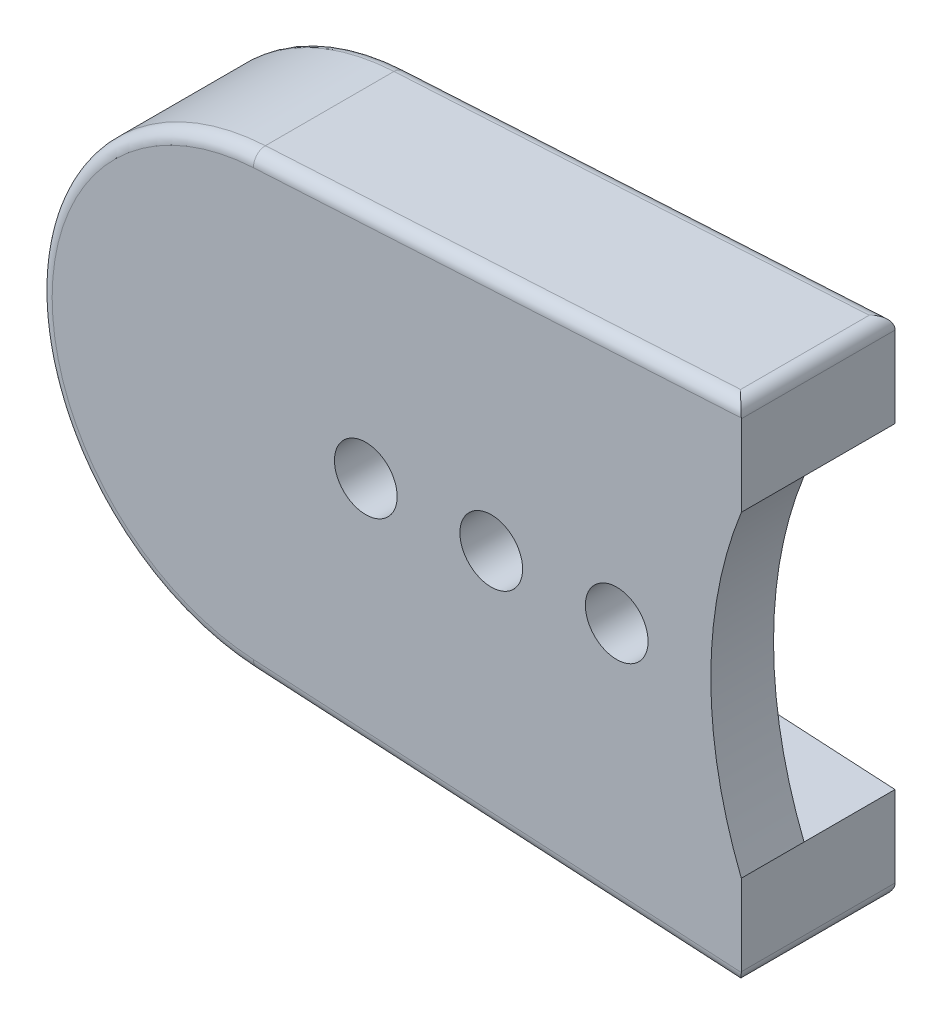
ISO-10303-21;
HEADER;
FILE_DESCRIPTION(('STEP AP214'),'2;1');
FILE_NAME('part.step','',(''),(''),'','','');
FILE_SCHEMA(('AUTOMOTIVE_DESIGN { 1 0 10303 214 1 1 1 1 }'));
ENDSEC;
DATA;
#1=APPLICATION_CONTEXT('core data for automotive mechanical design processes');
#2=APPLICATION_PROTOCOL_DEFINITION('international standard','automotive_design',2000,#1);
#3=PRODUCT_CONTEXT('',#1,'mechanical');
#4=PRODUCT('Part','Part','',(#3));
#5=PRODUCT_RELATED_PRODUCT_CATEGORY('part','',(#4));
#6=PRODUCT_DEFINITION_FORMATION('','',#4);
#7=PRODUCT_DEFINITION_CONTEXT('part definition',#1,'design');
#8=PRODUCT_DEFINITION('design','',#6,#7);
#9=PRODUCT_DEFINITION_SHAPE('','',#8);
#10=(LENGTH_UNIT() NAMED_UNIT(*) SI_UNIT(.MILLI.,.METRE.));
#11=(NAMED_UNIT(*) PLANE_ANGLE_UNIT() SI_UNIT($,.RADIAN.));
#12=(NAMED_UNIT(*) SI_UNIT($,.STERADIAN.) SOLID_ANGLE_UNIT());
#13=UNCERTAINTY_MEASURE_WITH_UNIT(LENGTH_MEASURE(1.E-05),#10,'distance_accuracy_value','');
#14=(GEOMETRIC_REPRESENTATION_CONTEXT(3) GLOBAL_UNCERTAINTY_ASSIGNED_CONTEXT((#13)) GLOBAL_UNIT_ASSIGNED_CONTEXT((#10,
#11,#12)) REPRESENTATION_CONTEXT('',''));
#15=CARTESIAN_POINT('',(0.,0.,0.));
#16=DIRECTION('',(0.,0.,1.));
#17=DIRECTION('',(1.,0.,0.));
#18=AXIS2_PLACEMENT_3D('',#15,#16,#17);
#19=CARTESIAN_POINT('',(0.,0.,1.));
#20=DIRECTION('',(0.,0.,1.));
#21=DIRECTION('',(1.,0.,0.));
#22=AXIS2_PLACEMENT_3D('',#19,#20,#21);
#23=PLANE('',#22);
#24=CARTESIAN_POINT('',(-10.3,0.,1.));
#25=DIRECTION('',(0.,0.,1.));
#26=DIRECTION('',(1.,0.,0.));
#27=AXIS2_PLACEMENT_3D('',#24,#25,#26);
#28=CIRCLE('',#27,0.500000000000001);
#29=CARTESIAN_POINT('',(-9.8,0.,1.));
#30=VERTEX_POINT('',#29);
#31=EDGE_CURVE('E322',#30,#30,#28,.T.);
#32=ORIENTED_EDGE('',*,*,#31,.F.);
#33=EDGE_LOOP('',(#32));
#34=FACE_BOUND('',#33,.T.);
#35=DIRECTION('',(0.998452256545436,-0.0556155679583174,0.));
#36=VECTOR('',#35,1.);
#37=CARTESIAN_POINT('',(-0.232086901508914,-4.16659757390032,1.));
#38=LINE('',#37,#36);
#39=CARTESIAN_POINT('',(-14.0890929310583,-3.39473767225448,1.));
#40=VERTEX_POINT('',#39);
#41=CARTESIAN_POINT('',(-6.31379868961076,-3.82783540171158,1.));
#42=VERTEX_POINT('',#41);
#43=EDGE_CURVE('E194',#40,#42,#38,.T.);
#44=ORIENTED_EDGE('',*,*,#43,.T.);
#45=CARTESIAN_POINT('',(-6.51348914091985,-3.81671228811991,1.));
#46=DIRECTION('',(0.,0.,1.));
#47=DIRECTION('',(1.,0.,0.));
#48=AXIS2_PLACEMENT_3D('',#45,#46,#47);
#49=CIRCLE('',#48,0.2);
#50=CARTESIAN_POINT('',(-6.31348914091985,-3.81671228811991,1.));
#51=VERTEX_POINT('',#50);
#52=EDGE_CURVE('E197',#42,#51,#49,.T.);
#53=ORIENTED_EDGE('',*,*,#52,.T.);
#54=DIRECTION('',(0.,-1.,0.));
#55=VECTOR('',#54,1.);
#56=CARTESIAN_POINT('',(-6.31348914091985,0.,1.));
#57=LINE('',#56,#55);
#58=CARTESIAN_POINT('',(-6.31348914091985,-2.52583745864359,1.));
#59=VERTEX_POINT('',#58);
#60=EDGE_CURVE('E168',#59,#51,#57,.T.);
#61=ORIENTED_EDGE('',*,*,#60,.F.);
#62=CARTESIAN_POINT('',(0.,0.,1.));
#63=DIRECTION('',(0.,0.,-1.));
#64=DIRECTION('',(1.,0.,0.));
#65=AXIS2_PLACEMENT_3D('',#62,#63,#64);
#66=CIRCLE('',#65,6.8);
#67=CARTESIAN_POINT('',(-6.31348914091985,2.52583745864359,1.));
#68=VERTEX_POINT('',#67);
#69=EDGE_CURVE('E164',#59,#68,#66,.T.);
#70=ORIENTED_EDGE('',*,*,#69,.T.);
#71=DIRECTION('',(0.,1.,0.));
#72=VECTOR('',#71,1.);
#73=CARTESIAN_POINT('',(-6.31348914091985,0.,1.));
#74=LINE('',#73,#72);
#75=CARTESIAN_POINT('',(-6.31348914091985,3.81671228811991,1.));
#76=VERTEX_POINT('',#75);
#77=EDGE_CURVE('E147',#68,#76,#74,.T.);
#78=ORIENTED_EDGE('',*,*,#77,.T.);
#79=CARTESIAN_POINT('',(-6.51348914091985,3.81671228811991,1.));
#80=DIRECTION('',(0.,0.,1.));
#81=DIRECTION('',(1.,0.,0.));
#82=AXIS2_PLACEMENT_3D('',#79,#80,#81);
#83=CIRCLE('',#82,0.2);
#84=CARTESIAN_POINT('',(-6.31379868961076,3.82783540171157,1.));
#85=VERTEX_POINT('',#84);
#86=EDGE_CURVE('E180',#76,#85,#83,.T.);
#87=ORIENTED_EDGE('',*,*,#86,.T.);
#88=DIRECTION('',(-0.998452256545436,-0.0556155679583176,0.));
#89=VECTOR('',#88,1.);
#90=CARTESIAN_POINT('',(-0.232086901508914,4.16659757390031,1.));
#91=LINE('',#90,#89);
#92=CARTESIAN_POINT('',(-14.0890929310583,3.39473767225448,1.));
#93=VERTEX_POINT('',#92);
#94=EDGE_CURVE('E184',#85,#93,#91,.T.);
#95=ORIENTED_EDGE('',*,*,#94,.T.);
#96=CARTESIAN_POINT('',(-13.9,0.,1.));
#97=DIRECTION('',(0.,0.,1.));
#98=DIRECTION('',(1.,0.,0.));
#99=AXIS2_PLACEMENT_3D('',#96,#97,#98);
#100=CIRCLE('',#99,3.4);
#101=EDGE_CURVE('E191',#93,#40,#100,.T.);
#102=ORIENTED_EDGE('',*,*,#101,.T.);
#103=EDGE_LOOP('',(#44,#53,#61,#70,#78,#87,#95,#102));
#104=FACE_BOUND('',#103,.T.);
#105=CARTESIAN_POINT('',(-8.3,0.,1.));
#106=DIRECTION('',(0.,0.,1.));
#107=DIRECTION('',(1.,0.,0.));
#108=AXIS2_PLACEMENT_3D('',#105,#106,#107);
#109=CIRCLE('',#108,0.500000000000001);
#110=CARTESIAN_POINT('',(-7.8,0.,1.));
#111=VERTEX_POINT('',#110);
#112=EDGE_CURVE('E330',#111,#111,#109,.T.);
#113=ORIENTED_EDGE('',*,*,#112,.F.);
#114=EDGE_LOOP('',(#113));
#115=FACE_BOUND('',#114,.T.);
#116=CARTESIAN_POINT('',(-12.3,0.,1.));
#117=DIRECTION('',(0.,0.,1.));
#118=DIRECTION('',(1.,0.,0.));
#119=AXIS2_PLACEMENT_3D('',#116,#117,#118);
#120=CIRCLE('',#119,0.500000000000001);
#121=CARTESIAN_POINT('',(-11.8,0.,1.));
#122=VERTEX_POINT('',#121);
#123=EDGE_CURVE('E314',#122,#122,#120,.T.);
#124=ORIENTED_EDGE('',*,*,#123,.F.);
#125=EDGE_LOOP('',(#124));
#126=FACE_BOUND('',#125,.T.);
#127=ADVANCED_FACE('F41',(#34,#104,#115,#126),#23,.T.);
#128=CARTESIAN_POINT('',(0.,0.,0.));
#129=DIRECTION('',(0.,0.,1.));
#130=DIRECTION('',(1.,0.,0.));
#131=AXIS2_PLACEMENT_3D('',#128,#129,#130);
#132=PLANE('',#131);
#133=CARTESIAN_POINT('',(0.,0.,0.));
#134=DIRECTION('',(0.,0.,-1.));
#135=DIRECTION('',(1.,0.,0.));
#136=AXIS2_PLACEMENT_3D('',#133,#134,#135);
#137=CIRCLE('',#136,6.8);
#138=CARTESIAN_POINT('',(-6.31348914091985,-2.52583745864359,0.));
#139=VERTEX_POINT('',#138);
#140=CARTESIAN_POINT('',(-6.31348914091985,2.52583745864359,0.));
#141=VERTEX_POINT('',#140);
#142=EDGE_CURVE('E178',#139,#141,#137,.T.);
#143=ORIENTED_EDGE('',*,*,#142,.F.);
#144=DIRECTION('',(0.998452256545436,-0.0556155679583174,0.));
#145=VECTOR('',#144,1.);
#146=CARTESIAN_POINT('',(-14.0167926927125,-2.09674973874542,0.));
#147=LINE('',#146,#145);
#148=CARTESIAN_POINT('',(-14.0167926927125,-2.09674973874542,0.));
#149=VERTEX_POINT('',#148);
#150=EDGE_CURVE('E173',#149,#139,#147,.T.);
#151=ORIENTED_EDGE('',*,*,#150,.F.);
#152=CARTESIAN_POINT('',(-13.9,0.,0.));
#153=DIRECTION('',(0.,0.,1.));
#154=DIRECTION('',(1.,0.,0.));
#155=AXIS2_PLACEMENT_3D('',#152,#153,#154);
#156=CIRCLE('',#155,2.1);
#157=CARTESIAN_POINT('',(-14.0167926927125,2.09674973874541,0.));
#158=VERTEX_POINT('',#157);
#159=EDGE_CURVE('E342',#158,#149,#156,.T.);
#160=ORIENTED_EDGE('',*,*,#159,.F.);
#161=DIRECTION('',(-0.998452256545436,-0.0556155679583176,0.));
#162=VECTOR('',#161,1.);
#163=CARTESIAN_POINT('',(-6.31348914091985,2.52583745864359,0.));
#164=LINE('',#163,#162);
#165=EDGE_CURVE('E339',#141,#158,#164,.T.);
#166=ORIENTED_EDGE('',*,*,#165,.F.);
#167=EDGE_LOOP('',(#143,#151,#160,#166));
#168=FACE_BOUND('',#167,.T.);
#169=CARTESIAN_POINT('',(-8.3,0.,0.));
#170=DIRECTION('',(0.,0.,1.));
#171=DIRECTION('',(1.,0.,0.));
#172=AXIS2_PLACEMENT_3D('',#169,#170,#171);
#173=CIRCLE('',#172,0.500000000000001);
#174=CARTESIAN_POINT('',(-7.8,0.,0.));
#175=VERTEX_POINT('',#174);
#176=EDGE_CURVE('E326',#175,#175,#173,.T.);
#177=ORIENTED_EDGE('',*,*,#176,.T.);
#178=EDGE_LOOP('',(#177));
#179=FACE_BOUND('',#178,.T.);
#180=CARTESIAN_POINT('',(-10.3,0.,0.));
#181=DIRECTION('',(0.,0.,1.));
#182=DIRECTION('',(1.,0.,0.));
#183=AXIS2_PLACEMENT_3D('',#180,#181,#182);
#184=CIRCLE('',#183,0.500000000000001);
#185=CARTESIAN_POINT('',(-9.8,0.,0.));
#186=VERTEX_POINT('',#185);
#187=EDGE_CURVE('E318',#186,#186,#184,.T.);
#188=ORIENTED_EDGE('',*,*,#187,.T.);
#189=EDGE_LOOP('',(#188));
#190=FACE_BOUND('',#189,.T.);
#191=CARTESIAN_POINT('',(-12.3,0.,0.));
#192=DIRECTION('',(0.,0.,1.));
#193=DIRECTION('',(1.,0.,0.));
#194=AXIS2_PLACEMENT_3D('',#191,#192,#193);
#195=CIRCLE('',#194,0.500000000000001);
#196=CARTESIAN_POINT('',(-11.8,0.,0.));
#197=VERTEX_POINT('',#196);
#198=EDGE_CURVE('E313',#197,#197,#195,.T.);
#199=ORIENTED_EDGE('',*,*,#198,.T.);
#200=EDGE_LOOP('',(#199));
#201=FACE_BOUND('',#200,.T.);
#202=ADVANCED_FACE('F357',(#168,#179,#190,#201),#132,.F.);
#203=CARTESIAN_POINT('',(0.,0.,1.));
#204=DIRECTION('',(0.,0.,-1.));
#205=DIRECTION('',(-1.,0.,0.));
#206=AXIS2_PLACEMENT_3D('',#203,#204,#205);
#207=CYLINDRICAL_SURFACE('',#206,6.8);
#208=ORIENTED_EDGE('',*,*,#142,.T.);
#209=DIRECTION('',(0.,0.,-1.));
#210=VECTOR('',#209,1.);
#211=CARTESIAN_POINT('',(-6.31348914091985,2.52583745864359,1.));
#212=LINE('',#211,#210);
#213=EDGE_CURVE('E153',#68,#141,#212,.T.);
#214=ORIENTED_EDGE('',*,*,#213,.F.);
#215=ORIENTED_EDGE('',*,*,#69,.F.);
#216=DIRECTION('',(0.,0.,-1.));
#217=VECTOR('',#216,1.);
#218=CARTESIAN_POINT('',(-6.31348914091985,-2.52583745864359,1.));
#219=LINE('',#218,#217);
#220=EDGE_CURVE('E172',#59,#139,#219,.T.);
#221=ORIENTED_EDGE('',*,*,#220,.T.);
#222=EDGE_LOOP('',(#208,#214,#215,#221));
#223=FACE_BOUND('',#222,.T.);
#224=ADVANCED_FACE('F176',(#223),#207,.F.);
#225=CARTESIAN_POINT('',(-8.3,0.,1.));
#226=DIRECTION('',(0.,0.,-1.));
#227=DIRECTION('',(-1.,0.,0.));
#228=AXIS2_PLACEMENT_3D('',#225,#226,#227);
#229=CYLINDRICAL_SURFACE('',#228,0.500000000000001);
#230=ORIENTED_EDGE('',*,*,#112,.T.);
#231=EDGE_LOOP('',(#230));
#232=FACE_BOUND('',#231,.T.);
#233=ORIENTED_EDGE('',*,*,#176,.F.);
#234=EDGE_LOOP('',(#233));
#235=FACE_BOUND('',#234,.T.);
#236=ADVANCED_FACE('F423',(#232,#235),#229,.F.);
#237=CARTESIAN_POINT('',(-10.3,0.,1.));
#238=DIRECTION('',(0.,0.,-1.));
#239=DIRECTION('',(-1.,0.,0.));
#240=AXIS2_PLACEMENT_3D('',#237,#238,#239);
#241=CYLINDRICAL_SURFACE('',#240,0.500000000000001);
#242=ORIENTED_EDGE('',*,*,#31,.T.);
#243=EDGE_LOOP('',(#242));
#244=FACE_BOUND('',#243,.T.);
#245=ORIENTED_EDGE('',*,*,#187,.F.);
#246=EDGE_LOOP('',(#245));
#247=FACE_BOUND('',#246,.T.);
#248=ADVANCED_FACE('F459',(#244,#247),#241,.F.);
#249=CARTESIAN_POINT('',(-12.3,0.,1.));
#250=DIRECTION('',(0.,0.,-1.));
#251=DIRECTION('',(-1.,0.,0.));
#252=AXIS2_PLACEMENT_3D('',#249,#250,#251);
#253=CYLINDRICAL_SURFACE('',#252,0.500000000000001);
#254=ORIENTED_EDGE('',*,*,#123,.T.);
#255=EDGE_LOOP('',(#254));
#256=FACE_BOUND('',#255,.T.);
#257=ORIENTED_EDGE('',*,*,#198,.F.);
#258=EDGE_LOOP('',(#257));
#259=FACE_BOUND('',#258,.T.);
#260=ADVANCED_FACE('F455',(#256,#259),#253,.F.);
#261=CARTESIAN_POINT('',(-0.159786663163101,-2.86860964039125,-15.2355867945463));
#262=DIRECTION('',(-0.0556155679583173,-0.998452256545436,0.));
#263=DIRECTION('',(0.998452256545436,-0.0556155679583173,0.));
#264=AXIS2_PLACEMENT_3D('',#261,#262,#263);
#265=PLANE('',#264);
#266=DIRECTION('',(0.,0.,1.));
#267=VECTOR('',#266,1.);
#268=CARTESIAN_POINT('',(-14.0167926927125,-2.09674973874542,-15.2355867945463));
#269=LINE('',#268,#267);
#270=CARTESIAN_POINT('',(-14.0167926927125,-2.09674973874542,-1.45));
#271=VERTEX_POINT('',#270);
#272=EDGE_CURVE('E300',#271,#149,#269,.T.);
#273=ORIENTED_EDGE('',*,*,#272,.T.);
#274=ORIENTED_EDGE('',*,*,#150,.T.);
#275=DIRECTION('',(0.,0.,1.));
#276=VECTOR('',#275,1.);
#277=CARTESIAN_POINT('',(-6.31348914091985,-2.52583745864359,-15.2355867945463));
#278=LINE('',#277,#276);
#279=CARTESIAN_POINT('',(-6.31348914091985,-2.52583745864359,-1.45));
#280=VERTEX_POINT('',#279);
#281=EDGE_CURVE('E304',#280,#139,#278,.T.);
#282=ORIENTED_EDGE('',*,*,#281,.F.);
#283=DIRECTION('',(0.998452256545436,-0.0556155679583174,0.));
#284=VECTOR('',#283,1.);
#285=CARTESIAN_POINT('',(-0.159786663163102,-2.86860964039125,-1.45));
#286=LINE('',#285,#284);
#287=EDGE_CURVE('E282',#271,#280,#286,.T.);
#288=ORIENTED_EDGE('',*,*,#287,.F.);
#289=EDGE_LOOP('',(#273,#274,#282,#288));
#290=FACE_BOUND('',#289,.T.);
#291=ADVANCED_FACE('F349',(#290),#265,.F.);
#292=CARTESIAN_POINT('',(-0.159786663163102,2.86860964039125,-15.2355867945463));
#293=DIRECTION('',(-0.0556155679583176,0.998452256545436,0.));
#294=DIRECTION('',(-0.998452256545436,-0.0556155679583176,0.));
#295=AXIS2_PLACEMENT_3D('',#292,#293,#294);
#296=PLANE('',#295);
#297=DIRECTION('',(0.,0.,1.));
#298=VECTOR('',#297,1.);
#299=CARTESIAN_POINT('',(-6.31348914091985,2.52583745864359,-15.2355867945463));
#300=LINE('',#299,#298);
#301=CARTESIAN_POINT('',(-6.31348914091985,2.52583745864359,-1.45));
#302=VERTEX_POINT('',#301);
#303=EDGE_CURVE('E293',#302,#141,#300,.T.);
#304=ORIENTED_EDGE('',*,*,#303,.T.);
#305=ORIENTED_EDGE('',*,*,#165,.T.);
#306=DIRECTION('',(0.,0.,1.));
#307=VECTOR('',#306,1.);
#308=CARTESIAN_POINT('',(-14.0167926927125,2.09674973874541,-15.2355867945463));
#309=LINE('',#308,#307);
#310=CARTESIAN_POINT('',(-14.0167926927125,2.09674973874541,-1.45));
#311=VERTEX_POINT('',#310);
#312=EDGE_CURVE('E296',#311,#158,#309,.T.);
#313=ORIENTED_EDGE('',*,*,#312,.F.);
#314=DIRECTION('',(-0.998452256545436,-0.0556155679583176,0.));
#315=VECTOR('',#314,1.);
#316=CARTESIAN_POINT('',(-0.159786663163102,2.86860964039125,-1.45));
#317=LINE('',#316,#315);
#318=EDGE_CURVE('E271',#302,#311,#317,.T.);
#319=ORIENTED_EDGE('',*,*,#318,.F.);
#320=EDGE_LOOP('',(#304,#305,#313,#319));
#321=FACE_BOUND('',#320,.T.);
#322=ADVANCED_FACE('F360',(#321),#296,.F.);
#323=CARTESIAN_POINT('',(-13.9,0.,-15.2355867945463));
#324=DIRECTION('',(0.,0.,1.));
#325=DIRECTION('',(1.,0.,0.));
#326=AXIS2_PLACEMENT_3D('',#323,#324,#325);
#327=CYLINDRICAL_SURFACE('',#326,2.1);
#328=ORIENTED_EDGE('',*,*,#312,.T.);
#329=ORIENTED_EDGE('',*,*,#159,.T.);
#330=ORIENTED_EDGE('',*,*,#272,.F.);
#331=CARTESIAN_POINT('',(-13.9,0.,-1.45));
#332=DIRECTION('',(0.,0.,-1.));
#333=DIRECTION('',(-1.,0.,0.));
#334=AXIS2_PLACEMENT_3D('',#331,#332,#333);
#335=CIRCLE('',#334,2.1);
#336=EDGE_CURVE('E276',#311,#271,#335,.F.);
#337=ORIENTED_EDGE('',*,*,#336,.F.);
#338=EDGE_LOOP('',(#328,#329,#330,#337));
#339=FACE_BOUND('',#338,.T.);
#340=ADVANCED_FACE('F363',(#339),#327,.F.);
#341=CARTESIAN_POINT('',(0.,0.,-1.45));
#342=DIRECTION('',(0.,0.,-1.));
#343=DIRECTION('',(-1.,0.,0.));
#344=AXIS2_PLACEMENT_3D('',#341,#342,#343);
#345=PLANE('',#344);
#346=DIRECTION('',(0.,-1.,0.));
#347=VECTOR('',#346,1.);
#348=CARTESIAN_POINT('',(-6.31348914091985,0.,-1.45));
#349=LINE('',#348,#347);
#350=CARTESIAN_POINT('',(-6.31348914091985,-3.81671228811991,-1.45));
#351=VERTEX_POINT('',#350);
#352=EDGE_CURVE('E160',#280,#351,#349,.T.);
#353=ORIENTED_EDGE('',*,*,#352,.T.);
#354=CARTESIAN_POINT('',(-6.51348914091985,-3.81671228811991,-1.45));
#355=DIRECTION('',(0.,0.,-1.));
#356=DIRECTION('',(-1.,0.,0.));
#357=AXIS2_PLACEMENT_3D('',#354,#355,#356);
#358=CIRCLE('',#357,0.2);
#359=CARTESIAN_POINT('',(-6.31379868961076,-3.82783540171158,-1.45));
#360=VERTEX_POINT('',#359);
#361=EDGE_CURVE('E225',#351,#360,#358,.T.);
#362=ORIENTED_EDGE('',*,*,#361,.T.);
#363=DIRECTION('',(0.998452256545436,-0.0556155679583174,0.));
#364=VECTOR('',#363,1.);
#365=CARTESIAN_POINT('',(-0.232086901508914,-4.16659757390031,-1.45));
#366=LINE('',#365,#364);
#367=CARTESIAN_POINT('',(-14.0890929310583,-3.39473767225449,-1.45));
#368=VERTEX_POINT('',#367);
#369=EDGE_CURVE('E222',#360,#368,#366,.F.);
#370=ORIENTED_EDGE('',*,*,#369,.T.);
#371=CARTESIAN_POINT('',(-13.9,0.,-1.45));
#372=DIRECTION('',(0.,0.,-1.));
#373=DIRECTION('',(-1.,0.,0.));
#374=AXIS2_PLACEMENT_3D('',#371,#372,#373);
#375=CIRCLE('',#374,3.4);
#376=CARTESIAN_POINT('',(-14.0890929310583,3.39473767225448,-1.45));
#377=VERTEX_POINT('',#376);
#378=EDGE_CURVE('E219',#368,#377,#375,.T.);
#379=ORIENTED_EDGE('',*,*,#378,.T.);
#380=DIRECTION('',(-0.998452256545436,-0.0556155679583176,0.));
#381=VECTOR('',#380,1.);
#382=CARTESIAN_POINT('',(-0.232086901508914,4.16659757390031,-1.45));
#383=LINE('',#382,#381);
#384=CARTESIAN_POINT('',(-6.31379868961076,3.82783540171157,-1.45));
#385=VERTEX_POINT('',#384);
#386=EDGE_CURVE('E216',#377,#385,#383,.F.);
#387=ORIENTED_EDGE('',*,*,#386,.T.);
#388=CARTESIAN_POINT('',(-6.51348914091985,3.81671228811991,-1.45));
#389=DIRECTION('',(0.,0.,-1.));
#390=DIRECTION('',(-1.,0.,0.));
#391=AXIS2_PLACEMENT_3D('',#388,#389,#390);
#392=CIRCLE('',#391,0.2);
#393=CARTESIAN_POINT('',(-6.31348914091985,3.81671228811991,-1.45));
#394=VERTEX_POINT('',#393);
#395=EDGE_CURVE('E213',#385,#394,#392,.T.);
#396=ORIENTED_EDGE('',*,*,#395,.T.);
#397=DIRECTION('',(0.,1.,0.));
#398=VECTOR('',#397,1.);
#399=CARTESIAN_POINT('',(-6.31348914091985,0.,-1.45));
#400=LINE('',#399,#398);
#401=EDGE_CURVE('E285',#302,#394,#400,.T.);
#402=ORIENTED_EDGE('',*,*,#401,.F.);
#403=ORIENTED_EDGE('',*,*,#318,.T.);
#404=ORIENTED_EDGE('',*,*,#336,.T.);
#405=ORIENTED_EDGE('',*,*,#287,.T.);
#406=EDGE_LOOP('',(#353,#362,#370,#379,#387,#396,#402,#403,#404,#405));
#407=FACE_BOUND('',#406,.T.);
#408=ADVANCED_FACE('F364',(#407),#345,.T.);
#409=CARTESIAN_POINT('',(-13.9,0.,-15.2355867945463));
#410=DIRECTION('',(0.,0.,1.));
#411=DIRECTION('',(1.,0.,0.));
#412=AXIS2_PLACEMENT_3D('',#409,#410,#411);
#413=CYLINDRICAL_SURFACE('',#412,3.6);
#414=DIRECTION('',(0.,0.,1.));
#415=VECTOR('',#414,1.);
#416=CARTESIAN_POINT('',(-14.1002160446499,-3.59442812356357,-15.2355867945463));
#417=LINE('',#416,#415);
#418=CARTESIAN_POINT('',(-14.1002160446499,-3.59442812356357,-1.25));
#419=VERTEX_POINT('',#418);
#420=CARTESIAN_POINT('',(-14.1002160446499,-3.59442812356357,0.799999999999999));
#421=VERTEX_POINT('',#420);
#422=EDGE_CURVE('E159',#419,#421,#417,.T.);
#423=ORIENTED_EDGE('',*,*,#422,.T.);
#424=CARTESIAN_POINT('',(-13.9,0.,0.799999999999999));
#425=DIRECTION('',(0.,0.,1.));
#426=DIRECTION('',(1.,0.,0.));
#427=AXIS2_PLACEMENT_3D('',#424,#425,#426);
#428=CIRCLE('',#427,3.6);
#429=CARTESIAN_POINT('',(-14.1002160446499,3.59442812356357,0.799999999999999));
#430=VERTEX_POINT('',#429);
#431=EDGE_CURVE('E231',#421,#430,#428,.F.);
#432=ORIENTED_EDGE('',*,*,#431,.T.);
#433=DIRECTION('',(0.,0.,1.));
#434=VECTOR('',#433,1.);
#435=CARTESIAN_POINT('',(-14.1002160446499,3.59442812356357,-15.2355867945463));
#436=LINE('',#435,#434);
#437=CARTESIAN_POINT('',(-14.1002160446499,3.59442812356357,-1.25));
#438=VERTEX_POINT('',#437);
#439=EDGE_CURVE('E310',#438,#430,#436,.T.);
#440=ORIENTED_EDGE('',*,*,#439,.F.);
#441=CARTESIAN_POINT('',(-13.9,0.,-1.25));
#442=DIRECTION('',(0.,0.,-1.));
#443=DIRECTION('',(-1.,0.,0.));
#444=AXIS2_PLACEMENT_3D('',#441,#442,#443);
#445=CIRCLE('',#444,3.6);
#446=EDGE_CURVE('E228',#438,#419,#445,.F.);
#447=ORIENTED_EDGE('',*,*,#446,.T.);
#448=EDGE_LOOP('',(#423,#432,#440,#447));
#449=FACE_BOUND('',#448,.T.);
#450=ADVANCED_FACE('F383',(#449),#413,.T.);
#451=CARTESIAN_POINT('',(-0.243210015100577,-4.3662880252094,-15.2355867945463));
#452=DIRECTION('',(-0.0556155679583174,-0.998452256545436,0.));
#453=DIRECTION('',(0.998452256545436,-0.0556155679583174,0.));
#454=AXIS2_PLACEMENT_3D('',#451,#452,#453);
#455=PLANE('',#454);
#456=DIRECTION('',(0.,0.,1.));
#457=VECTOR('',#456,1.);
#458=CARTESIAN_POINT('',(-6.52461225451151,-4.016402739429,0.999999999999994));
#459=LINE('',#458,#457);
#460=CARTESIAN_POINT('',(-6.52461225451151,-4.016402739429,-1.25));
#461=VERTEX_POINT('',#460);
#462=CARTESIAN_POINT('',(-6.52461225451151,-4.016402739429,0.8));
#463=VERTEX_POINT('',#462);
#464=EDGE_CURVE('E203',#461,#463,#459,.T.);
#465=ORIENTED_EDGE('',*,*,#464,.T.);
#466=DIRECTION('',(0.998452256545436,-0.0556155679583174,0.));
#467=VECTOR('',#466,1.);
#468=CARTESIAN_POINT('',(-0.243210015100577,-4.3662880252094,0.799999999999999));
#469=LINE('',#468,#467);
#470=EDGE_CURVE('E206',#463,#421,#469,.F.);
#471=ORIENTED_EDGE('',*,*,#470,.T.);
#472=ORIENTED_EDGE('',*,*,#422,.F.);
#473=DIRECTION('',(0.998452256545436,-0.0556155679583174,0.));
#474=VECTOR('',#473,1.);
#475=CARTESIAN_POINT('',(-0.243210015100578,-4.3662880252094,-1.25));
#476=LINE('',#475,#474);
#477=EDGE_CURVE('E200',#419,#461,#476,.T.);
#478=ORIENTED_EDGE('',*,*,#477,.T.);
#479=EDGE_LOOP('',(#465,#471,#472,#478));
#480=FACE_BOUND('',#479,.T.);
#481=ADVANCED_FACE('F385',(#480),#455,.T.);
#482=CARTESIAN_POINT('',(-6.31348914091985,0.,-15.2355867945463));
#483=DIRECTION('',(-1.,0.,0.));
#484=DIRECTION('',(0.,-1.,0.));
#485=AXIS2_PLACEMENT_3D('',#482,#483,#484);
#486=PLANE('',#485);
#487=ORIENTED_EDGE('',*,*,#60,.T.);
#488=DIRECTION('',(0.,0.,1.));
#489=VECTOR('',#488,1.);
#490=CARTESIAN_POINT('',(-6.31348914091985,-3.81671228811991,-1.45));
#491=LINE('',#490,#489);
#492=EDGE_CURVE('E210',#51,#351,#491,.F.);
#493=ORIENTED_EDGE('',*,*,#492,.T.);
#494=ORIENTED_EDGE('',*,*,#352,.F.);
#495=ORIENTED_EDGE('',*,*,#281,.T.);
#496=ORIENTED_EDGE('',*,*,#220,.F.);
#497=EDGE_LOOP('',(#487,#493,#494,#495,#496));
#498=FACE_BOUND('',#497,.T.);
#499=ADVANCED_FACE('F404',(#498),#486,.F.);
#500=CARTESIAN_POINT('',(-6.31348914091985,0.,-15.2355867945463));
#501=DIRECTION('',(1.,0.,0.));
#502=DIRECTION('',(0.,0.,-1.));
#503=AXIS2_PLACEMENT_3D('',#500,#501,#502);
#504=PLANE('',#503);
#505=ORIENTED_EDGE('',*,*,#401,.T.);
#506=DIRECTION('',(0.,0.,1.));
#507=VECTOR('',#506,1.);
#508=CARTESIAN_POINT('',(-6.31348914091985,3.81671228811991,-15.2355867945463));
#509=LINE('',#508,#507);
#510=EDGE_CURVE('E11',#394,#76,#509,.T.);
#511=ORIENTED_EDGE('',*,*,#510,.T.);
#512=ORIENTED_EDGE('',*,*,#77,.F.);
#513=ORIENTED_EDGE('',*,*,#213,.T.);
#514=ORIENTED_EDGE('',*,*,#303,.F.);
#515=EDGE_LOOP('',(#505,#511,#512,#513,#514));
#516=FACE_BOUND('',#515,.T.);
#517=ADVANCED_FACE('F150',(#516),#504,.T.);
#518=CARTESIAN_POINT('',(-0.243210015100578,4.3662880252094,-15.2355867945463));
#519=DIRECTION('',(-0.0556155679583176,0.998452256545436,0.));
#520=DIRECTION('',(-0.998452256545436,-0.0556155679583176,0.));
#521=AXIS2_PLACEMENT_3D('',#518,#519,#520);
#522=PLANE('',#521);
#523=ORIENTED_EDGE('',*,*,#439,.T.);
#524=DIRECTION('',(-0.998452256545436,-0.0556155679583176,0.));
#525=VECTOR('',#524,1.);
#526=CARTESIAN_POINT('',(-0.243210015100578,4.3662880252094,0.799999999999999));
#527=LINE('',#526,#525);
#528=CARTESIAN_POINT('',(-6.52461225451151,4.016402739429,0.8));
#529=VERTEX_POINT('',#528);
#530=EDGE_CURVE('E51',#430,#529,#527,.F.);
#531=ORIENTED_EDGE('',*,*,#530,.T.);
#532=DIRECTION('',(0.,0.,1.));
#533=VECTOR('',#532,1.);
#534=CARTESIAN_POINT('',(-6.52461225451151,4.016402739429,-15.2355867945463));
#535=LINE('',#534,#533);
#536=CARTESIAN_POINT('',(-6.52461225451151,4.016402739429,-1.25));
#537=VERTEX_POINT('',#536);
#538=EDGE_CURVE('E59',#529,#537,#535,.F.);
#539=ORIENTED_EDGE('',*,*,#538,.T.);
#540=DIRECTION('',(-0.998452256545436,-0.0556155679583176,0.));
#541=VECTOR('',#540,1.);
#542=CARTESIAN_POINT('',(-0.243210015100579,4.3662880252094,-1.25));
#543=LINE('',#542,#541);
#544=EDGE_CURVE('E236',#537,#438,#543,.T.);
#545=ORIENTED_EDGE('',*,*,#544,.T.);
#546=EDGE_LOOP('',(#523,#531,#539,#545));
#547=FACE_BOUND('',#546,.T.);
#548=ADVANCED_FACE('F397',(#547),#522,.T.);
#549=CARTESIAN_POINT('',(-0.232086901508915,4.16659757390031,-1.25));
#550=DIRECTION('',(-0.998452256545436,-0.0556155679583176,0.));
#551=DIRECTION('',(0.0556155679583176,-0.998452256545436,0.));
#552=AXIS2_PLACEMENT_3D('',#549,#550,#551);
#553=CYLINDRICAL_SURFACE('',#552,0.2);
#554=CARTESIAN_POINT('',(-14.0890929310583,3.39473767225448,-1.25));
#555=DIRECTION('',(-0.998452256545436,-0.0556155679583195,0.));
#556=DIRECTION('',(0.0556155679583195,-0.998452256545436,0.));
#557=AXIS2_PLACEMENT_3D('',#554,#555,#556);
#558=CIRCLE('',#557,0.2);
#559=EDGE_CURVE('E262',#438,#377,#558,.T.);
#560=ORIENTED_EDGE('',*,*,#559,.F.);
#561=ORIENTED_EDGE('',*,*,#544,.F.);
#562=CARTESIAN_POINT('',(-6.51348914091985,3.81671228811991,-1.25));
#563=DIRECTION('',(0.706012361294288,0.0393261452428676,0.707106781186547));
#564=DIRECTION('',(-0.706012361294288,-0.0393261452428676,0.707106781186547));
#565=AXIS2_PLACEMENT_3D('',#562,#563,#564);
#566=ELLIPSE('',#565,0.282842712474619,0.2);
#567=EDGE_CURVE('E45',#385,#537,#566,.T.);
#568=ORIENTED_EDGE('',*,*,#567,.F.);
#569=ORIENTED_EDGE('',*,*,#386,.F.);
#570=EDGE_LOOP('',(#560,#561,#568,#569));
#571=FACE_BOUND('',#570,.T.);
#572=ADVANCED_FACE('F43',(#571),#553,.T.);
#573=CARTESIAN_POINT('',(-6.51348914091985,3.81671228811991,-15.2355867945463));
#574=DIRECTION('',(0.,0.,1.));
#575=DIRECTION('',(1.,0.,0.));
#576=AXIS2_PLACEMENT_3D('',#573,#574,#575);
#577=CYLINDRICAL_SURFACE('',#576,0.2);
#578=ORIENTED_EDGE('',*,*,#567,.T.);
#579=ORIENTED_EDGE('',*,*,#538,.F.);
#580=CARTESIAN_POINT('',(-6.51348914091985,3.81671228811991,0.799999999999997));
#581=DIRECTION('',(-0.706012361294288,-0.0393261452428676,0.707106781186547));
#582=DIRECTION('',(0.706012361294288,0.0393261452428676,0.707106781186547));
#583=AXIS2_PLACEMENT_3D('',#580,#581,#582);
#584=ELLIPSE('',#583,0.282842712474619,0.2);
#585=EDGE_CURVE('E259',#85,#529,#584,.T.);
#586=ORIENTED_EDGE('',*,*,#585,.F.);
#587=ORIENTED_EDGE('',*,*,#86,.F.);
#588=ORIENTED_EDGE('',*,*,#510,.F.);
#589=ORIENTED_EDGE('',*,*,#395,.F.);
#590=EDGE_LOOP('',(#578,#579,#586,#587,#588,#589));
#591=FACE_BOUND('',#590,.T.);
#592=ADVANCED_FACE('F401',(#591),#577,.T.);
#593=CARTESIAN_POINT('',(-13.9,0.,-1.25));
#594=DIRECTION('',(0.,0.,-1.));
#595=DIRECTION('',(-1.,0.,0.));
#596=AXIS2_PLACEMENT_3D('',#593,#594,#595);
#597=TOROIDAL_SURFACE('',#596,3.4,0.2);
#598=ORIENTED_EDGE('',*,*,#559,.T.);
#599=ORIENTED_EDGE('',*,*,#378,.F.);
#600=CARTESIAN_POINT('',(-14.0890929310583,-3.39473767225449,-1.25));
#601=DIRECTION('',(0.998452256545436,-0.0556155679583195,0.));
#602=DIRECTION('',(0.0556155679583195,0.998452256545436,0.));
#603=AXIS2_PLACEMENT_3D('',#600,#601,#602);
#604=CIRCLE('',#603,0.2);
#605=EDGE_CURVE('E255',#419,#368,#604,.T.);
#606=ORIENTED_EDGE('',*,*,#605,.F.);
#607=ORIENTED_EDGE('',*,*,#446,.F.);
#608=EDGE_LOOP('',(#598,#599,#606,#607));
#609=FACE_BOUND('',#608,.T.);
#610=ADVANCED_FACE('F379',(#609),#597,.T.);
#611=CARTESIAN_POINT('',(-0.232086901508914,4.16659757390031,0.8));
#612=DIRECTION('',(-0.998452256545436,-0.0556155679583176,0.));
#613=DIRECTION('',(0.0556155679583176,-0.998452256545436,0.));
#614=AXIS2_PLACEMENT_3D('',#611,#612,#613);
#615=CYLINDRICAL_SURFACE('',#614,0.2);
#616=ORIENTED_EDGE('',*,*,#585,.T.);
#617=ORIENTED_EDGE('',*,*,#530,.F.);
#618=CARTESIAN_POINT('',(-14.0890929310583,3.39473767225448,0.8));
#619=DIRECTION('',(-0.998452256545436,-0.0556155679583195,0.));
#620=DIRECTION('',(0.0556155679583195,-0.998452256545436,0.));
#621=AXIS2_PLACEMENT_3D('',#618,#619,#620);
#622=CIRCLE('',#621,0.2);
#623=EDGE_CURVE('E251',#93,#430,#622,.T.);
#624=ORIENTED_EDGE('',*,*,#623,.F.);
#625=ORIENTED_EDGE('',*,*,#94,.F.);
#626=EDGE_LOOP('',(#616,#617,#624,#625));
#627=FACE_BOUND('',#626,.T.);
#628=ADVANCED_FACE('F399',(#627),#615,.T.);
#629=CARTESIAN_POINT('',(-0.232086901508914,-4.16659757390031,-1.25));
#630=DIRECTION('',(0.998452256545436,-0.0556155679583174,0.));
#631=DIRECTION('',(0.0556155679583174,0.998452256545436,0.));
#632=AXIS2_PLACEMENT_3D('',#629,#630,#631);
#633=CYLINDRICAL_SURFACE('',#632,0.2);
#634=ORIENTED_EDGE('',*,*,#605,.T.);
#635=ORIENTED_EDGE('',*,*,#369,.F.);
#636=CARTESIAN_POINT('',(-6.51348914091985,-3.81671228811991,-1.25));
#637=DIRECTION('',(0.706012361294288,-0.0393261452428675,0.707106781186547));
#638=DIRECTION('',(0.706012361294288,-0.0393261452428675,-0.707106781186547));
#639=AXIS2_PLACEMENT_3D('',#636,#637,#638);
#640=ELLIPSE('',#639,0.282842712474619,0.2);
#641=EDGE_CURVE('E247',#461,#360,#640,.T.);
#642=ORIENTED_EDGE('',*,*,#641,.F.);
#643=ORIENTED_EDGE('',*,*,#477,.F.);
#644=EDGE_LOOP('',(#634,#635,#642,#643));
#645=FACE_BOUND('',#644,.T.);
#646=ADVANCED_FACE('F376',(#645),#633,.T.);
#647=CARTESIAN_POINT('',(-13.9,0.,0.799999999999999));
#648=DIRECTION('',(0.,0.,1.));
#649=DIRECTION('',(1.,0.,0.));
#650=AXIS2_PLACEMENT_3D('',#647,#648,#649);
#651=TOROIDAL_SURFACE('',#650,3.4,0.2);
#652=ORIENTED_EDGE('',*,*,#623,.T.);
#653=ORIENTED_EDGE('',*,*,#431,.F.);
#654=CARTESIAN_POINT('',(-14.0890929310583,-3.39473767225448,0.8));
#655=DIRECTION('',(0.998452256545436,-0.0556155679583194,0.));
#656=DIRECTION('',(0.0556155679583194,0.998452256545436,0.));
#657=AXIS2_PLACEMENT_3D('',#654,#655,#656);
#658=CIRCLE('',#657,0.2);
#659=EDGE_CURVE('E244',#40,#421,#658,.T.);
#660=ORIENTED_EDGE('',*,*,#659,.F.);
#661=ORIENTED_EDGE('',*,*,#101,.F.);
#662=EDGE_LOOP('',(#652,#653,#660,#661));
#663=FACE_BOUND('',#662,.T.);
#664=ADVANCED_FACE('F396',(#663),#651,.T.);
#665=CARTESIAN_POINT('',(-6.51348914091985,-3.81671228811991,-15.2355867945463));
#666=DIRECTION('',(0.,0.,-1.));
#667=DIRECTION('',(-1.,0.,0.));
#668=AXIS2_PLACEMENT_3D('',#665,#666,#667);
#669=CYLINDRICAL_SURFACE('',#668,0.2);
#670=ORIENTED_EDGE('',*,*,#492,.F.);
#671=ORIENTED_EDGE('',*,*,#52,.F.);
#672=CARTESIAN_POINT('',(-6.51348914091985,-3.81671228811991,0.799999999999997));
#673=DIRECTION('',(0.706012361294289,-0.0393261452428675,-0.707106781186547));
#674=DIRECTION('',(-0.706012361294289,0.0393261452428675,-0.707106781186547));
#675=AXIS2_PLACEMENT_3D('',#672,#673,#674);
#676=ELLIPSE('',#675,0.282842712474619,0.2);
#677=EDGE_CURVE('E241',#463,#42,#676,.F.);
#678=ORIENTED_EDGE('',*,*,#677,.F.);
#679=ORIENTED_EDGE('',*,*,#464,.F.);
#680=ORIENTED_EDGE('',*,*,#641,.T.);
#681=ORIENTED_EDGE('',*,*,#361,.F.);
#682=EDGE_LOOP('',(#670,#671,#678,#679,#680,#681));
#683=FACE_BOUND('',#682,.T.);
#684=ADVANCED_FACE('F369',(#683),#669,.T.);
#685=CARTESIAN_POINT('',(-0.232086901508914,-4.16659757390032,0.8));
#686=DIRECTION('',(0.998452256545436,-0.0556155679583174,0.));
#687=DIRECTION('',(0.0556155679583174,0.998452256545436,0.));
#688=AXIS2_PLACEMENT_3D('',#685,#686,#687);
#689=CYLINDRICAL_SURFACE('',#688,0.2);
#690=ORIENTED_EDGE('',*,*,#659,.T.);
#691=ORIENTED_EDGE('',*,*,#470,.F.);
#692=ORIENTED_EDGE('',*,*,#677,.T.);
#693=ORIENTED_EDGE('',*,*,#43,.F.);
#694=EDGE_LOOP('',(#690,#691,#692,#693));
#695=FACE_BOUND('',#694,.T.);
#696=ADVANCED_FACE('F388',(#695),#689,.T.);
#697=CLOSED_SHELL('',(#127,#202,#224,#236,#248,#260,#291,#322,#340,#408,#450,#481,#499,#517,
#548,#572,#592,#610,#628,#646,#664,#684,#696));
#698=MANIFOLD_SOLID_BREP('B2',#697);
#699=ADVANCED_BREP_SHAPE_REPRESENTATION('',(#18,#698),#14);
#700=SHAPE_DEFINITION_REPRESENTATION(#9,#699);
ENDSEC;
END-ISO-10303-21;
